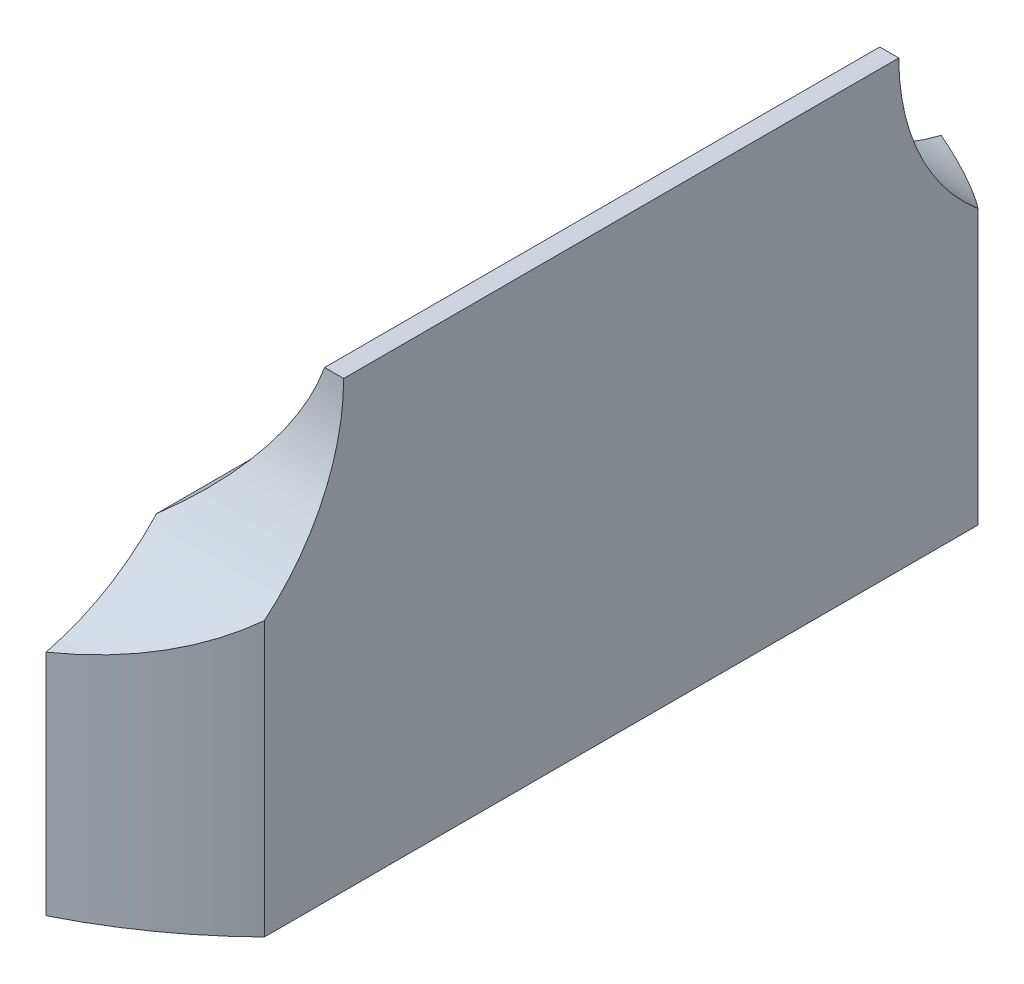
ISO-10303-21;
HEADER;
FILE_DESCRIPTION(('STEP AP214'),'2;1');
FILE_NAME('part.step','',(''),(''),'','','');
FILE_SCHEMA(('AUTOMOTIVE_DESIGN { 1 0 10303 214 1 1 1 1 }'));
ENDSEC;
DATA;
#1=APPLICATION_CONTEXT('core data for automotive mechanical design processes');
#2=APPLICATION_PROTOCOL_DEFINITION('international standard','automotive_design',2000,#1);
#3=PRODUCT_CONTEXT('',#1,'mechanical');
#4=PRODUCT('Part','Part','',(#3));
#5=PRODUCT_RELATED_PRODUCT_CATEGORY('part','',(#4));
#6=PRODUCT_DEFINITION_FORMATION('','',#4);
#7=PRODUCT_DEFINITION_CONTEXT('part definition',#1,'design');
#8=PRODUCT_DEFINITION('design','',#6,#7);
#9=PRODUCT_DEFINITION_SHAPE('','',#8);
#10=(LENGTH_UNIT() NAMED_UNIT(*) SI_UNIT(.MILLI.,.METRE.));
#11=(NAMED_UNIT(*) PLANE_ANGLE_UNIT() SI_UNIT($,.RADIAN.));
#12=(NAMED_UNIT(*) SI_UNIT($,.STERADIAN.) SOLID_ANGLE_UNIT());
#13=UNCERTAINTY_MEASURE_WITH_UNIT(LENGTH_MEASURE(1.E-05),#10,'distance_accuracy_value','');
#14=(GEOMETRIC_REPRESENTATION_CONTEXT(3) GLOBAL_UNCERTAINTY_ASSIGNED_CONTEXT((#13)) GLOBAL_UNIT_ASSIGNED_CONTEXT((#10,
#11,#12)) REPRESENTATION_CONTEXT('',''));
#15=CARTESIAN_POINT('',(0.,0.,0.));
#16=DIRECTION('',(0.,0.,1.));
#17=DIRECTION('',(1.,0.,0.));
#18=AXIS2_PLACEMENT_3D('',#15,#16,#17);
#19=CARTESIAN_POINT('',(0.,0.,0.));
#20=DIRECTION('',(0.,1.,0.));
#21=DIRECTION('',(1.,0.,0.));
#22=AXIS2_PLACEMENT_3D('',#19,#20,#21);
#23=CYLINDRICAL_SURFACE('',#22,28.575);
#24=CARTESIAN_POINT('',(20.0020530060041,15.6760389155511,-20.4058763733114));
#25=CARTESIAN_POINT('',(19.8435494802002,15.5457537766223,-20.5609577418275));
#26=CARTESIAN_POINT('',(19.6807528595742,15.4213732783918,-20.7165446343731));
#27=CARTESIAN_POINT('',(19.3454434694339,15.1827910012391,-21.0292928394244));
#28=CARTESIAN_POINT('',(19.172850345806,15.0687024158377,-21.1864544617273));
#29=CARTESIAN_POINT('',(18.8179535629603,14.8503928572297,-21.5016015878262));
#30=CARTESIAN_POINT('',(18.6355610630698,14.7463004387995,-21.6595757840877));
#31=CARTESIAN_POINT('',(18.2610770081837,14.5476095926334,-21.9756878153445));
#32=CARTESIAN_POINT('',(18.0688903310553,14.4531518311793,-22.1338011921385));
#33=CARTESIAN_POINT('',(17.6748130361651,14.2733491472535,-22.4495505687749));
#34=CARTESIAN_POINT('',(17.4728228341515,14.1881541863242,-22.6071472688206));
#35=CARTESIAN_POINT('',(17.0319153394616,14.015767557453,-22.9420802775227));
#36=CARTESIAN_POINT('',(16.7919669819444,13.9301563699468,-23.118874587271));
#37=CARTESIAN_POINT('',(16.3741851210456,13.7938503418461,-23.4169105422294));
#38=CARTESIAN_POINT('',(16.1982906380658,13.7401865331342,-23.5395324129033));
#39=CARTESIAN_POINT('',(15.8144821696148,13.6306796890099,-23.8004663992747));
#40=CARTESIAN_POINT('',(15.6058928719229,13.5758274398683,-23.9382035511536));
#41=CARTESIAN_POINT('',(15.1819042358411,13.4727961223819,-24.2100122394977));
#42=CARTESIAN_POINT('',(14.9664599277952,13.4246830183906,-24.3440384520072));
#43=CARTESIAN_POINT('',(14.5287451710389,13.3346324609428,-24.6080660927425));
#44=CARTESIAN_POINT('',(14.3064274229232,13.2927632635867,-24.7380122795871));
#45=CARTESIAN_POINT('',(13.8549697241299,13.2146986192916,-24.993592069885));
#46=CARTESIAN_POINT('',(13.6257812218346,13.1785720800737,-25.1191609521419));
#47=CARTESIAN_POINT('',(13.2723211743118,13.1276200394208,-25.3064836648907));
#48=CARTESIAN_POINT('',(13.1494923683897,13.1107778427691,-25.3704305880086));
#49=CARTESIAN_POINT('',(12.9178331046597,13.080525900026,-25.4889308951634));
#50=CARTESIAN_POINT('',(12.8091237905014,13.0669481063863,-25.5436782101677));
#51=CARTESIAN_POINT('',(12.7000284990376,13.0539016943946,-25.5977770274421));
#52=B_SPLINE_CURVE_WITH_KNOTS('',3,(#24,#25,#26,#27,#28,#29,#30,#31,#32,#33,#34,#35,#36,#37,#38,
#39,#40,#41,#42,#43,#44,#45,#46,#47,#48,#49,#50,#51),.UNSPECIFIED.,.F.,.F.,(4,2,2,2,2,2,2,2,2,2,
2,2,2,4),(0.,0.771414648447857,1.55048055829369,2.3385050413571,3.13675141055374,
3.9464351484217,4.87629613722426,5.53926639781894,6.30678120127093,7.08134998684325,
7.86384737289748,8.65512170492151,9.07359734234514,9.44099909454981),.UNSPECIFIED.);
#53=CARTESIAN_POINT('',(20.0025000148616,15.6756845461096,-20.4060349636921));
#54=VERTEX_POINT('',#53);
#55=CARTESIAN_POINT('',(12.7000000000208,13.0539439966948,-25.597729758866));
#56=VERTEX_POINT('',#55);
#57=EDGE_CURVE('E133',#54,#56,#52,.T.);
#58=ORIENTED_EDGE('',*,*,#57,.F.);
#59=DIRECTION('',(0.,1.,0.));
#60=VECTOR('',#59,1.);
#61=CARTESIAN_POINT('',(20.0025,0.,-20.4066317345612));
#62=LINE('',#61,#60);
#63=CARTESIAN_POINT('',(20.0025,0.,-20.4066317345612));
#64=VERTEX_POINT('',#63);
#65=EDGE_CURVE('E395',#54,#64,#62,.F.);
#66=ORIENTED_EDGE('',*,*,#65,.T.);
#67=CARTESIAN_POINT('',(0.,0.,0.));
#68=DIRECTION('',(0.,1.,0.));
#69=DIRECTION('',(0.,0.,1.));
#70=AXIS2_PLACEMENT_3D('',#67,#68,#69);
#71=CIRCLE('',#70,28.575);
#72=CARTESIAN_POINT('',(12.7,0.,-25.5976683508479));
#73=VERTEX_POINT('',#72);
#74=EDGE_CURVE('E233',#64,#73,#71,.T.);
#75=ORIENTED_EDGE('',*,*,#74,.T.);
#76=DIRECTION('',(0.,1.,0.));
#77=VECTOR('',#76,1.);
#78=CARTESIAN_POINT('',(12.7,0.,-25.5976683508479));
#79=LINE('',#78,#77);
#80=EDGE_CURVE('E169',#73,#56,#79,.T.);
#81=ORIENTED_EDGE('',*,*,#80,.T.);
#82=EDGE_LOOP('',(#58,#66,#75,#81));
#83=FACE_BOUND('',#82,.T.);
#84=ADVANCED_FACE('F49',(#83),#23,.T.);
#85=CARTESIAN_POINT('',(12.7,0.,25.5976683508479));
#86=VERTEX_POINT('',#85);
#87=CARTESIAN_POINT('',(20.0025,0.,20.4066317345612));
#88=VERTEX_POINT('',#87);
#89=EDGE_CURVE('E231',#86,#88,#71,.T.);
#90=ORIENTED_EDGE('',*,*,#89,.T.);
#91=DIRECTION('',(0.,1.,0.));
#92=VECTOR('',#91,1.);
#93=CARTESIAN_POINT('',(20.0025,0.,20.4066317345612));
#94=LINE('',#93,#92);
#95=CARTESIAN_POINT('',(20.0025,15.6754043847483,20.4066317345612));
#96=VERTEX_POINT('',#95);
#97=EDGE_CURVE('E399',#88,#96,#94,.T.);
#98=ORIENTED_EDGE('',*,*,#97,.T.);
#99=CARTESIAN_POINT('',(0.962642906827022,12.700010357177,28.5587804997681));
#100=CARTESIAN_POINT('',(1.36077615471735,12.7000623405138,28.5453656936281));
#101=CARTESIAN_POINT('',(1.75862826128871,12.7000777129775,28.523615158628));
#102=CARTESIAN_POINT('',(2.55307900061478,12.7004445435274,28.4635033900954));
#103=CARTESIAN_POINT('',(2.9496776222913,12.7007960045757,28.4251420101689));
#104=CARTESIAN_POINT('',(3.74118367355271,12.7022448100345,28.3318388399094));
#105=CARTESIAN_POINT('',(4.13608981752724,12.7033426454521,28.2768861481122));
#106=CARTESIAN_POINT('',(4.92324947877102,12.7069381444701,28.1505085420081));
#107=CARTESIAN_POINT('',(5.3155030100975,12.7094358006464,28.0790837150642));
#108=CARTESIAN_POINT('',(6.09971504540883,12.7166858056776,27.9192672109259));
#109=CARTESIAN_POINT('',(6.4916472676977,12.7214556291278,27.8307472519799));
#110=CARTESIAN_POINT('',(7.27137942149177,12.7342954373665,27.6372759357328));
#111=CARTESIAN_POINT('',(7.65917937835118,12.7423654018945,27.5323246793108));
#112=CARTESIAN_POINT('',(8.42975641138034,12.7630247665727,27.3062442771493));
#113=CARTESIAN_POINT('',(8.8125354073083,12.775612383907,27.1851215250436));
#114=CARTESIAN_POINT('',(9.57240197152831,12.8067151020722,26.926952705874));
#115=CARTESIAN_POINT('',(9.94948991381911,12.8252298116008,26.7899076903666));
#116=CARTESIAN_POINT('',(10.8728927614276,12.88022897177,26.4321390510183));
#117=CARTESIAN_POINT('',(11.4154826589438,12.9210691874319,26.2023506985232));
#118=CARTESIAN_POINT('',(12.4837500300381,13.024700133787,25.7105492096721));
#119=CARTESIAN_POINT('',(13.0094275076119,13.0874908592944,25.4485360809295));
#120=CARTESIAN_POINT('',(14.0386470887018,13.2413188739397,24.8955218155012));
#121=CARTESIAN_POINT('',(14.5422624233341,13.332253103732,24.6046290316585));
#122=CARTESIAN_POINT('',(15.5253033043412,13.5496409178739,23.9964408281848));
#123=CARTESIAN_POINT('',(16.0047377492519,13.6760813218248,23.6791552366417));
#124=CARTESIAN_POINT('',(16.800254791929,13.9292795846889,23.1180863947747));
#125=CARTESIAN_POINT('',(17.123479173042,14.0453697569777,22.8795842085311));
#126=CARTESIAN_POINT('',(17.7534814150312,14.3020869374188,22.3942506215131));
#127=CARTESIAN_POINT('',(18.0602635179013,14.442707576658,22.1474213960954));
#128=CARTESIAN_POINT('',(18.6552298779792,14.75098919158,21.6486405813578));
#129=CARTESIAN_POINT('',(18.9434257676909,14.9186330198069,21.39669232832));
#130=CARTESIAN_POINT('',(19.4993082033762,15.2832535278009,20.8913521389599));
#131=CARTESIAN_POINT('',(19.7669984562148,15.4802248869015,20.6379604725079));
#132=CARTESIAN_POINT('',(20.2341271811735,15.8672649280327,20.1791498346762));
#133=CARTESIAN_POINT('',(20.4372307469284,16.0523162472183,19.9732236591284));
#134=CARTESIAN_POINT('',(20.8271119044121,16.4437967724493,19.5663328075717));
#135=CARTESIAN_POINT('',(21.0138928933059,16.6502215104805,19.3653671054332));
#136=CARTESIAN_POINT('',(21.3701713398591,17.0844581875766,18.9714767796639));
#137=CARTESIAN_POINT('',(21.5396731307898,17.3122647368571,18.778550147209));
#138=CARTESIAN_POINT('',(21.8606787701723,17.7888329775473,18.4038644446777));
#139=CARTESIAN_POINT('',(22.0121823840227,18.0375949420331,18.2221055201843));
#140=CARTESIAN_POINT('',(22.2974382732527,18.5565357068221,17.8719385757042));
#141=CARTESIAN_POINT('',(22.4310835821065,18.8268293218901,17.7036132435075));
#142=CARTESIAN_POINT('',(22.6792372799584,19.38600360836,17.3845820896443));
#143=CARTESIAN_POINT('',(22.7937450751443,19.674884856127,17.2338768147488));
#144=CARTESIAN_POINT('',(23.0034597029794,20.2691361993014,16.9529413248224));
#145=CARTESIAN_POINT('',(23.0986674152611,20.5745055424336,16.822710176711));
#146=CARTESIAN_POINT('',(23.2697906029362,21.1992400095342,16.5852020750128));
#147=CARTESIAN_POINT('',(23.3457083799338,21.518603458441,16.4779223831843));
#148=CARTESIAN_POINT('',(23.4701116512248,22.1280288875913,16.3001450747159));
#149=CARTESIAN_POINT('',(23.5208356826167,22.4167889086254,16.2267309961218));
#150=CARTESIAN_POINT('',(23.6076984469343,23.0008228755959,16.100096420655));
#151=CARTESIAN_POINT('',(23.6438389598952,23.2960960219103,16.0468734593424));
#152=CARTESIAN_POINT('',(23.7016972573092,23.8916760012838,15.9612926922762));
#153=CARTESIAN_POINT('',(23.7233869803638,24.1919914737936,15.9289754860677));
#154=CARTESIAN_POINT('',(23.7450719580584,24.6440955572715,15.8966136679713));
#155=CARTESIAN_POINT('',(23.7504920138431,24.795104241373,15.8885120518039));
#156=CARTESIAN_POINT('',(23.7577175691802,25.0974022832643,15.8777046290734));
#157=CARTESIAN_POINT('',(23.7595230358135,25.2486916435978,15.8749988716518));
#158=CARTESIAN_POINT('',(23.7595244060145,25.4,15.875));
#159=B_SPLINE_CURVE_WITH_KNOTS('',3,(#99,#100,#101,#102,#103,#104,#105,#106,#107,#108,#109,#110,
#111,#112,#113,#114,#115,#116,#117,#118,#119,#120,#121,#122,#123,#124,#125,#126,#127,#128,#129,
#130,#131,#132,#133,#134,#135,#136,#137,#138,#139,#140,#141,#142,#143,#144,#145,#146,#147,#148,
#149,#150,#151,#152,#153,#154,#155,#156,#157,#158),.UNSPECIFIED.,.F.,.F.,(4,2,2,2,2,2,2,2,2,2,2,
2,2,2,2,2,2,2,2,2,2,2,2,2,2,2,2,2,2,4),(0.,1.19499017098555,2.38999087382109,3.58577847726653,
4.78155973878477,5.98668965456981,7.19181217181565,8.39645962969053,9.60102757401706,
11.3715014476631,13.1419749030226,14.9060402345202,16.6694515834793,17.9228644895058,
19.1759524514992,20.4282483792196,21.6803173888097,22.709415177226,23.7382982701966,
24.7669227021674,25.7955605405169,26.830107096135,27.8646857464337,28.8992172335378,
29.9336252261262,30.8392539807823,31.7447721627436,32.6520436478983,33.1058917422523,
33.5597439699006),.UNSPECIFIED.);
#160=CARTESIAN_POINT('',(12.7,13.0539279019213,25.5976683508479));
#161=VERTEX_POINT('',#160);
#162=EDGE_CURVE('E124',#161,#96,#159,.T.);
#163=ORIENTED_EDGE('',*,*,#162,.F.);
#164=DIRECTION('',(0.,1.,0.));
#165=VECTOR('',#164,1.);
#166=CARTESIAN_POINT('',(12.7,0.,25.5976683508479));
#167=LINE('',#166,#165);
#168=EDGE_CURVE('E76',#161,#86,#167,.F.);
#169=ORIENTED_EDGE('',*,*,#168,.T.);
#170=EDGE_LOOP('',(#90,#98,#163,#169));
#171=FACE_BOUND('',#170,.T.);
#172=ADVANCED_FACE('F415',(#171),#23,.T.);
#173=CARTESIAN_POINT('',(0.,0.,0.));
#174=DIRECTION('',(0.,1.,0.));
#175=DIRECTION('',(1.,0.,0.));
#176=AXIS2_PLACEMENT_3D('',#173,#174,#175);
#177=PLANE('',#176);
#178=DIRECTION('',(0.,0.,-1.));
#179=VECTOR('',#178,1.);
#180=CARTESIAN_POINT('',(20.0025,0.,0.));
#181=LINE('',#180,#179);
#182=EDGE_CURVE('E392',#88,#64,#181,.T.);
#183=ORIENTED_EDGE('',*,*,#182,.F.);
#184=ORIENTED_EDGE('',*,*,#89,.F.);
#185=DIRECTION('',(0.,0.,1.));
#186=VECTOR('',#185,1.);
#187=CARTESIAN_POINT('',(12.7,0.,0.));
#188=LINE('',#187,#186);
#189=EDGE_CURVE('E383',#73,#86,#188,.T.);
#190=ORIENTED_EDGE('',*,*,#189,.F.);
#191=ORIENTED_EDGE('',*,*,#74,.F.);
#192=EDGE_LOOP('',(#183,#184,#190,#191));
#193=FACE_BOUND('',#192,.T.);
#194=ADVANCED_FACE('F188',(#193),#177,.F.);
#195=CARTESIAN_POINT('',(-31.75,25.4,-28.575));
#196=DIRECTION('',(-1.,0.,0.));
#197=DIRECTION('',(0.,0.,1.));
#198=AXIS2_PLACEMENT_3D('',#195,#196,#197);
#199=CYLINDRICAL_SURFACE('',#198,12.7);
#200=CARTESIAN_POINT('',(20.0025,25.4,-28.575));
#201=DIRECTION('',(1.,0.,0.));
#202=DIRECTION('',(0.,0.,-1.));
#203=AXIS2_PLACEMENT_3D('',#200,#201,#202);
#204=CIRCLE('',#203,12.7);
#205=CARTESIAN_POINT('',(20.0025,25.4,-15.875));
#206=VERTEX_POINT('',#205);
#207=EDGE_CURVE('E69',#54,#206,#204,.F.);
#208=ORIENTED_EDGE('',*,*,#207,.F.);
#209=ORIENTED_EDGE('',*,*,#57,.T.);
#210=CARTESIAN_POINT('',(12.7,25.4,-28.575));
#211=DIRECTION('',(-1.,0.,0.));
#212=DIRECTION('',(0.,0.,1.));
#213=AXIS2_PLACEMENT_3D('',#210,#211,#212);
#214=CIRCLE('',#213,12.7);
#215=CARTESIAN_POINT('',(12.6999998776071,16.7536943821638,-19.2730440936521));
#216=VERTEX_POINT('',#215);
#217=EDGE_CURVE('E385',#216,#56,#214,.F.);
#218=ORIENTED_EDGE('',*,*,#217,.F.);
#219=CARTESIAN_POINT('',(18.9130122421383,25.4,-15.875));
#220=CARTESIAN_POINT('',(18.8649267701276,25.2639897417401,-15.8782658130291));
#221=CARTESIAN_POINT('',(18.8152953670513,25.1285309257077,-15.8822402304314));
#222=CARTESIAN_POINT('',(18.7175425515635,24.8708271769366,-15.891901767634));
#223=CARTESIAN_POINT('',(18.6696786936336,24.7484774138373,-15.897405367998));
#224=CARTESIAN_POINT('',(18.5762514037336,24.5167474831415,-15.9101206708496));
#225=CARTESIAN_POINT('',(18.5309169729571,24.40726321809,-15.9171141930367));
#226=CARTESIAN_POINT('',(18.4432533362064,24.2010123461799,-15.9327532161595));
#227=CARTESIAN_POINT('',(18.4011240618108,24.1041423701733,-15.9411407333057));
#228=CARTESIAN_POINT('',(18.3321333416132,23.9490398388324,-15.9572715867362));
#229=CARTESIAN_POINT('',(18.3057354544199,23.8904939148226,-15.9639870115927));
#230=CARTESIAN_POINT('',(18.2141001513251,23.6899694318444,-15.9887289982669));
#231=CARTESIAN_POINT('',(18.147520693402,23.5489010060956,-16.0091512475608));
#232=CARTESIAN_POINT('',(17.9746736689671,23.1939948754332,-16.0661492965811));
#233=CARTESIAN_POINT('',(17.8662487246189,22.9816501186478,-16.1055184431235));
#234=CARTESIAN_POINT('',(17.677272095838,22.6279792170468,-16.1803186189473));
#235=CARTESIAN_POINT('',(17.5985487656297,22.4851198681557,-16.2131614030537));
#236=CARTESIAN_POINT('',(17.4824874226823,22.2807200340969,-16.2637973914384));
#237=CARTESIAN_POINT('',(17.4464104462817,22.2180201455716,-16.2798354943813));
#238=CARTESIAN_POINT('',(17.2955657068911,21.9592725642504,-16.3481433174333));
#239=CARTESIAN_POINT('',(17.1780724828052,21.7658116614905,-16.4043059453822));
#240=CARTESIAN_POINT('',(16.9347066407396,21.3805893602321,-16.5259910769282));
#241=CARTESIAN_POINT('',(16.8087032897309,21.1889699661711,-16.5916995147531));
#242=CARTESIAN_POINT('',(16.5482024052869,20.8078289338201,-16.7324877024895));
#243=CARTESIAN_POINT('',(16.4135741747817,20.6184653544609,-16.8077530421453));
#244=CARTESIAN_POINT('',(16.1357273839812,20.2422587413598,-16.9676623531427));
#245=CARTESIAN_POINT('',(15.9923795125351,20.0555891344569,-17.0524899574507));
#246=CARTESIAN_POINT('',(15.7938881021129,19.8066826888727,-17.172796801789));
#247=CARTESIAN_POINT('',(15.7409261628858,19.7411691162151,-17.2051651556037));
#248=CARTESIAN_POINT('',(15.6053022549377,19.5756513718066,-17.2887323968113));
#249=CARTESIAN_POINT('',(15.5221998405187,19.476328815644,-17.3405708807106));
#250=CARTESIAN_POINT('',(15.3056521620522,19.2227779882518,-17.477206364299));
#251=CARTESIAN_POINT('',(15.1711228074962,19.070324746574,-17.5635869252949));
#252=CARTESIAN_POINT('',(14.8951789073913,18.7674245029872,-17.74346876974));
#253=CARTESIAN_POINT('',(14.7536762969698,18.6171334075521,-17.8370969796175));
#254=CARTESIAN_POINT('',(14.4637104157867,18.3189143173905,-18.0314843983822));
#255=CARTESIAN_POINT('',(14.3151618076898,18.1711489463656,-18.1323656284104));
#256=CARTESIAN_POINT('',(14.0110461458261,17.8783538055498,-18.3412632203545));
#257=CARTESIAN_POINT('',(13.8553968969179,17.7334929866081,-18.4493965206603));
#258=CARTESIAN_POINT('',(13.5370393401194,17.4468914871081,-18.6728013221926));
#259=CARTESIAN_POINT('',(13.3742523292309,17.3053256483959,-18.7881846997305));
#260=CARTESIAN_POINT('',(13.0415921670739,17.0257091465779,-19.0261037305711));
#261=CARTESIAN_POINT('',(12.8716440172217,16.8878387902345,-19.1487465732943));
#262=CARTESIAN_POINT('',(12.7003087582626,16.7536174568902,-19.2733851829879));
#263=B_SPLINE_CURVE_WITH_KNOTS('',3,(#219,#220,#221,#222,#223,#224,#225,#226,#227,#228,#229,
#230,#231,#232,#233,#234,#235,#236,#237,#238,#239,#240,#241,#242,#243,#244,#245,#246,#247,#248,
#249,#250,#251,#252,#253,#254,#255,#256,#257,#258,#259,#260,#261,#262),.UNSPECIFIED.,.F.,.F.,(4,
2,2,2,2,2,2,2,2,2,2,2,2,2,2,2,2,2,2,2,2,4),(0.,0.432897476160335,0.827337291804095,
1.1834154611894,1.50126295242308,1.69496681352466,2.16681131081689,2.89137720953092,
3.39042068347179,3.61269985970137,4.31198749270514,5.02739664290938,5.75980646227688,
6.51003633690776,6.78077281564302,7.19920590469875,7.86176685091516,8.54160007779258,
9.23908131994807,9.9545585069028,10.6883539683441,11.4407664900623),.UNSPECIFIED.);
#264=CARTESIAN_POINT('',(18.9130122934536,25.4,-15.875));
#265=VERTEX_POINT('',#264);
#266=EDGE_CURVE('E168',#265,#216,#263,.T.);
#267=ORIENTED_EDGE('',*,*,#266,.F.);
#268=CARTESIAN_POINT('',(18.9130122421383,25.4,-15.875));
#269=DIRECTION('',(1.,0.,0.));
#270=VECTOR('',#269,1.);
#271=LINE('',#268,#270);
#272=EDGE_CURVE('E134',#265,#206,#271,.T.);
#273=ORIENTED_EDGE('',*,*,#272,.T.);
#274=EDGE_LOOP('',(#208,#209,#218,#267,#273));
#275=FACE_BOUND('',#274,.T.);
#276=ADVANCED_FACE('F187',(#275),#199,.F.);
#277=CARTESIAN_POINT('',(-31.75,25.4,28.575));
#278=DIRECTION('',(1.,0.,0.));
#279=DIRECTION('',(0.,0.,-1.));
#280=AXIS2_PLACEMENT_3D('',#277,#278,#279);
#281=CYLINDRICAL_SURFACE('',#280,12.7);
#282=CARTESIAN_POINT('',(20.0025,25.4,28.575));
#283=DIRECTION('',(1.,0.,0.));
#284=DIRECTION('',(0.,0.,-1.));
#285=AXIS2_PLACEMENT_3D('',#282,#283,#284);
#286=CIRCLE('',#285,12.7);
#287=CARTESIAN_POINT('',(20.0025,25.4,15.875));
#288=VERTEX_POINT('',#287);
#289=EDGE_CURVE('E111',#288,#96,#286,.F.);
#290=ORIENTED_EDGE('',*,*,#289,.F.);
#291=CARTESIAN_POINT('',(18.9130122421383,25.4,15.875));
#292=DIRECTION('',(1.,0.,0.));
#293=VECTOR('',#292,1.);
#294=LINE('',#291,#293);
#295=CARTESIAN_POINT('',(18.9130122421383,25.4,15.875));
#296=VERTEX_POINT('',#295);
#297=EDGE_CURVE('E121',#296,#288,#294,.T.);
#298=ORIENTED_EDGE('',*,*,#297,.F.);
#299=CARTESIAN_POINT('',(18.9130122421383,25.4,15.875));
#300=CARTESIAN_POINT('',(18.8626306139617,25.2648515466756,15.8749945230742));
#301=CARTESIAN_POINT('',(18.8117388143634,25.1298878280862,15.8771572967539));
#302=CARTESIAN_POINT('',(18.7129911937288,24.8726172906687,15.885362512169));
#303=CARTESIAN_POINT('',(18.6652659533616,24.750248661648,15.891044187907));
#304=CARTESIAN_POINT('',(18.5728546306278,24.5182281440699,15.9051676252374));
#305=CARTESIAN_POINT('',(18.5283233338814,24.4084950503976,15.9132878662174));
#306=CARTESIAN_POINT('',(18.4423374798795,24.2017341942269,15.9312770436212));
#307=CARTESIAN_POINT('',(18.401065569678,24.104606671614,15.9408648115192));
#308=CARTESIAN_POINT('',(18.3327385146829,23.9491621395889,15.9580038410319));
#309=CARTESIAN_POINT('',(18.3064031362829,23.8904550970778,15.9648950240667));
#310=CARTESIAN_POINT('',(18.214821528927,23.6896447286633,15.9898796098363));
#311=CARTESIAN_POINT('',(18.1478789795642,23.5485505464046,16.0098786774613));
#312=CARTESIAN_POINT('',(17.9745258197515,23.1937117546684,16.0662213665832));
#313=CARTESIAN_POINT('',(17.8661299308765,22.9814095599956,16.105589875716));
#314=CARTESIAN_POINT('',(17.6772123247371,22.6278482713256,16.1803674813764));
#315=CARTESIAN_POINT('',(17.5985218971597,22.4850535407258,16.2131918923475));
#316=CARTESIAN_POINT('',(17.4825837513526,22.2808110731247,16.2638320183319));
#317=CARTESIAN_POINT('',(17.4465785383834,22.2182078165639,16.2798646779853));
#318=CARTESIAN_POINT('',(17.2955417261986,21.959042182434,16.3483379506901));
#319=CARTESIAN_POINT('',(17.1777322591449,21.7650907090362,16.4046464450886));
#320=CARTESIAN_POINT('',(16.9338918935274,21.3792229034886,16.5265491973533));
#321=CARTESIAN_POINT('',(16.8077390226711,21.1874388988378,16.5923163525568));
#322=CARTESIAN_POINT('',(16.5471954784856,20.80635789158,16.7330996195928));
#323=CARTESIAN_POINT('',(16.4126853685393,20.6172054813791,16.8082856510397));
#324=CARTESIAN_POINT('',(16.1354170086756,20.2418492978283,16.967848007999));
#325=CARTESIAN_POINT('',(15.992542438783,20.055801769265,17.0523900385784));
#326=CARTESIAN_POINT('',(15.7943249882376,19.8072242799439,17.1725318866812));
#327=CARTESIAN_POINT('',(15.7411446431968,19.7414412657136,17.2050368496321));
#328=CARTESIAN_POINT('',(15.6055912497897,19.576045378208,17.2885422374064));
#329=CARTESIAN_POINT('',(15.5227771872964,19.4771036036946,17.3401601276869));
#330=CARTESIAN_POINT('',(15.3062808838588,19.2237371263822,17.4765763440612));
#331=CARTESIAN_POINT('',(15.1714813608398,19.0711072047981,17.562943063866));
#332=CARTESIAN_POINT('',(14.8949949846108,18.7678816535147,17.7427851345181));
#333=CARTESIAN_POINT('',(14.7532201774682,18.6174414028736,17.8363867440325));
#334=CARTESIAN_POINT('',(14.4627737896575,18.318971293728,18.0307335772933));
#335=CARTESIAN_POINT('',(14.314018579122,18.1711021191859,18.1316004242307));
#336=CARTESIAN_POINT('',(14.0096079480752,17.8781631963871,18.3404923691613));
#337=CARTESIAN_POINT('',(13.8538731847811,17.733259181041,18.4486340584848));
#338=CARTESIAN_POINT('',(13.5355006366764,17.446648869202,18.6720687032639));
#339=CARTESIAN_POINT('',(13.3727876071974,17.3051130409899,18.7874728451843));
#340=CARTESIAN_POINT('',(13.0404478449996,17.0256450657433,19.0254102417144));
#341=CARTESIAN_POINT('',(12.8707495635519,16.8878878066624,19.148049114531));
#342=CARTESIAN_POINT('',(12.6996846467272,16.7537714567145,19.2727028655673));
#343=B_SPLINE_CURVE_WITH_KNOTS('',3,(#299,#300,#301,#302,#303,#304,#305,#306,#307,#308,#309,
#310,#311,#312,#313,#314,#315,#316,#317,#318,#319,#320,#321,#322,#323,#324,#325,#326,#327,#328,
#329,#330,#331,#332,#333,#334,#335,#336,#337,#338,#339,#340,#341,#342),.UNSPECIFIED.,.F.,.F.,(4,
2,2,2,2,2,2,2,2,2,2,2,2,2,2,2,2,2,2,2,2,4),(0.,0.432691621593184,0.827041718816125,
1.18310582052274,1.50095987765639,1.69508382003292,2.1672998466326,2.89170276989662,
3.39052366717502,3.61244909697017,4.31353964446556,5.02963037266431,5.76128114403176,
6.50901687032367,6.78087143783146,7.19773064707998,7.86113466679904,8.54174121064509,
9.23979720504824,9.95553151588127,10.6891564633821,11.4408692076617),.UNSPECIFIED.);
#344=CARTESIAN_POINT('',(12.6999999344327,16.7538578159521,19.2727645156213));
#345=VERTEX_POINT('',#344);
#346=EDGE_CURVE('E173',#296,#345,#343,.T.);
#347=ORIENTED_EDGE('',*,*,#346,.T.);
#348=CARTESIAN_POINT('',(12.7,25.4,28.575));
#349=DIRECTION('',(-1.,0.,0.));
#350=DIRECTION('',(0.,0.,1.));
#351=AXIS2_PLACEMENT_3D('',#348,#349,#350);
#352=CIRCLE('',#351,12.7);
#353=EDGE_CURVE('E61',#161,#345,#352,.F.);
#354=ORIENTED_EDGE('',*,*,#353,.F.);
#355=ORIENTED_EDGE('',*,*,#162,.T.);
#356=EDGE_LOOP('',(#290,#298,#347,#354,#355));
#357=FACE_BOUND('',#356,.T.);
#358=ADVANCED_FACE('F119',(#357),#281,.F.);
#359=CARTESIAN_POINT('',(0.,25.4,0.));
#360=DIRECTION('',(0.,1.,0.));
#361=DIRECTION('',(0.,0.,1.));
#362=AXIS2_PLACEMENT_3D('',#359,#360,#361);
#363=PLANE('',#362);
#364=ORIENTED_EDGE('',*,*,#297,.T.);
#365=DIRECTION('',(0.,0.,-1.));
#366=VECTOR('',#365,1.);
#367=CARTESIAN_POINT('',(20.0025,25.4,0.));
#368=LINE('',#367,#366);
#369=EDGE_CURVE('E13',#288,#206,#368,.T.);
#370=ORIENTED_EDGE('',*,*,#369,.T.);
#371=ORIENTED_EDGE('',*,*,#272,.F.);
#372=DIRECTION('',(0.,0.,-1.));
#373=VECTOR('',#372,1.);
#374=CARTESIAN_POINT('',(18.9130122421383,25.4,103.07574));
#375=LINE('',#374,#373);
#376=EDGE_CURVE('E130',#265,#296,#375,.F.);
#377=ORIENTED_EDGE('',*,*,#376,.T.);
#378=EDGE_LOOP('',(#364,#370,#371,#377));
#379=FACE_BOUND('',#378,.T.);
#380=ADVANCED_FACE('F128',(#379),#363,.T.);
#381=CARTESIAN_POINT('',(0.9525,31.75,103.07574));
#382=DIRECTION('',(0.,0.,-1.));
#383=DIRECTION('',(1.,0.,0.));
#384=AXIS2_PLACEMENT_3D('',#381,#382,#383);
#385=CYLINDRICAL_SURFACE('',#384,19.05);
#386=DIRECTION('',(0.,0.,-1.));
#387=VECTOR('',#386,1.);
#388=CARTESIAN_POINT('',(12.7,16.7533755881532,103.07574));
#389=LINE('',#388,#387);
#390=EDGE_CURVE('E372',#345,#216,#389,.T.);
#391=ORIENTED_EDGE('',*,*,#390,.F.);
#392=ORIENTED_EDGE('',*,*,#346,.F.);
#393=ORIENTED_EDGE('',*,*,#376,.F.);
#394=ORIENTED_EDGE('',*,*,#266,.T.);
#395=EDGE_LOOP('',(#391,#392,#393,#394));
#396=FACE_BOUND('',#395,.T.);
#397=ADVANCED_FACE('F51',(#396),#385,.F.);
#398=CARTESIAN_POINT('',(12.7,0.,0.));
#399=DIRECTION('',(-1.,0.,0.));
#400=DIRECTION('',(0.,0.,1.));
#401=AXIS2_PLACEMENT_3D('',#398,#399,#400);
#402=PLANE('',#401);
#403=ORIENTED_EDGE('',*,*,#189,.T.);
#404=ORIENTED_EDGE('',*,*,#168,.F.);
#405=ORIENTED_EDGE('',*,*,#353,.T.);
#406=ORIENTED_EDGE('',*,*,#390,.T.);
#407=ORIENTED_EDGE('',*,*,#217,.T.);
#408=ORIENTED_EDGE('',*,*,#80,.F.);
#409=EDGE_LOOP('',(#403,#404,#405,#406,#407,#408));
#410=FACE_BOUND('',#409,.T.);
#411=ADVANCED_FACE('F153',(#410),#402,.T.);
#412=CARTESIAN_POINT('',(20.0025,0.,0.));
#413=DIRECTION('',(1.,0.,0.));
#414=DIRECTION('',(0.,0.,-1.));
#415=AXIS2_PLACEMENT_3D('',#412,#413,#414);
#416=PLANE('',#415);
#417=ORIENTED_EDGE('',*,*,#182,.T.);
#418=ORIENTED_EDGE('',*,*,#65,.F.);
#419=ORIENTED_EDGE('',*,*,#207,.T.);
#420=ORIENTED_EDGE('',*,*,#369,.F.);
#421=ORIENTED_EDGE('',*,*,#289,.T.);
#422=ORIENTED_EDGE('',*,*,#97,.F.);
#423=EDGE_LOOP('',(#417,#418,#419,#420,#421,#422));
#424=FACE_BOUND('',#423,.T.);
#425=ADVANCED_FACE('F110',(#424),#416,.T.);
#426=CLOSED_SHELL('',(#84,#172,#194,#276,#358,#380,#397,#411,#425));
#427=MANIFOLD_SOLID_BREP('B2',#426);
#428=ADVANCED_BREP_SHAPE_REPRESENTATION('',(#18,#427),#14);
#429=SHAPE_DEFINITION_REPRESENTATION(#9,#428);
ENDSEC;
END-ISO-10303-21;
